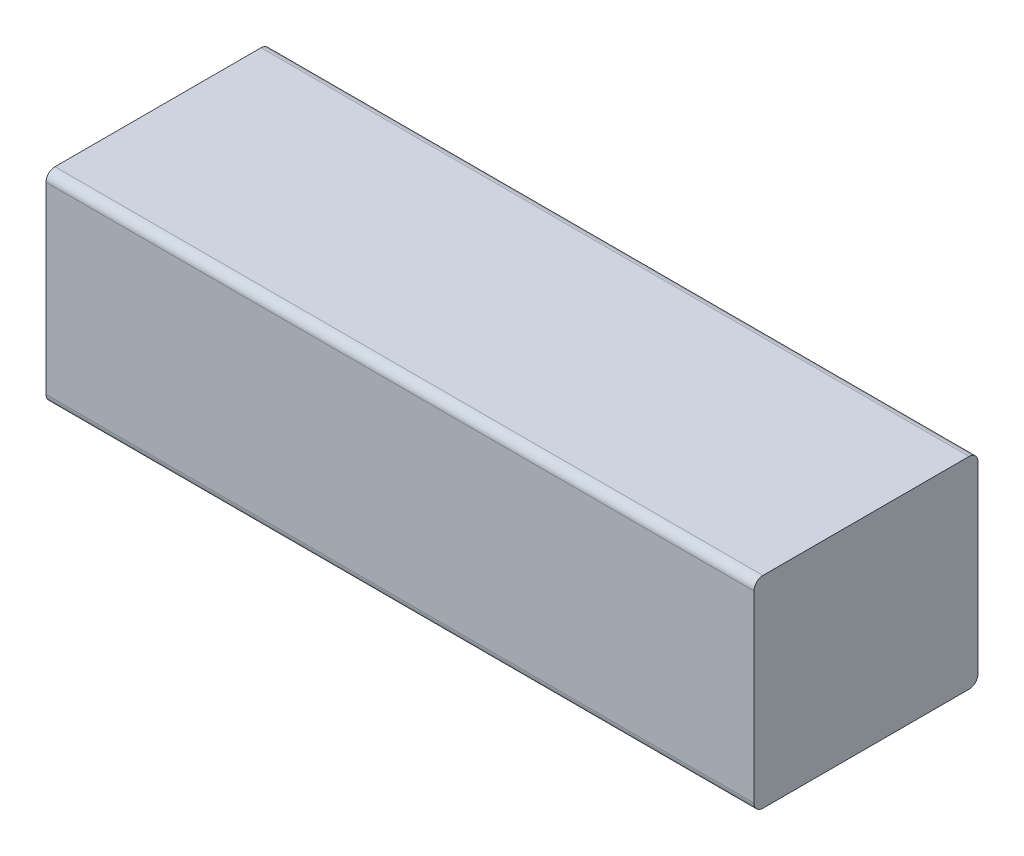
ISO-10303-21;
HEADER;
FILE_DESCRIPTION(('STEP AP214'),'2;1');
FILE_NAME('part.step','',(''),(''),'','','');
FILE_SCHEMA(('AUTOMOTIVE_DESIGN { 1 0 10303 214 1 1 1 1 }'));
ENDSEC;
DATA;
#1=APPLICATION_CONTEXT('core data for automotive mechanical design processes');
#2=APPLICATION_PROTOCOL_DEFINITION('international standard','automotive_design',2000,#1);
#3=PRODUCT_CONTEXT('',#1,'mechanical');
#4=PRODUCT('Part','Part','',(#3));
#5=PRODUCT_RELATED_PRODUCT_CATEGORY('part','',(#4));
#6=PRODUCT_DEFINITION_FORMATION('','',#4);
#7=PRODUCT_DEFINITION_CONTEXT('part definition',#1,'design');
#8=PRODUCT_DEFINITION('design','',#6,#7);
#9=PRODUCT_DEFINITION_SHAPE('','',#8);
#10=(LENGTH_UNIT() NAMED_UNIT(*) SI_UNIT(.MILLI.,.METRE.));
#11=(NAMED_UNIT(*) PLANE_ANGLE_UNIT() SI_UNIT($,.RADIAN.));
#12=(NAMED_UNIT(*) SI_UNIT($,.STERADIAN.) SOLID_ANGLE_UNIT());
#13=UNCERTAINTY_MEASURE_WITH_UNIT(LENGTH_MEASURE(1.E-05),#10,'distance_accuracy_value','');
#14=(GEOMETRIC_REPRESENTATION_CONTEXT(3) GLOBAL_UNCERTAINTY_ASSIGNED_CONTEXT((#13)) GLOBAL_UNIT_ASSIGNED_CONTEXT((#10,
#11,#12)) REPRESENTATION_CONTEXT('',''));
#15=CARTESIAN_POINT('',(0.,0.,0.));
#16=DIRECTION('',(0.,0.,1.));
#17=DIRECTION('',(1.,0.,0.));
#18=AXIS2_PLACEMENT_3D('',#15,#16,#17);
#19=CARTESIAN_POINT('',(0.,0.,50.));
#20=DIRECTION('',(1.,0.,0.));
#21=DIRECTION('',(0.,1.,0.));
#22=AXIS2_PLACEMENT_3D('',#19,#20,#21);
#23=PLANE('',#22);
#24=DIRECTION('',(0.,-1.,0.));
#25=VECTOR('',#24,1.);
#26=CARTESIAN_POINT('',(0.,0.,0.));
#27=LINE('',#26,#25);
#28=CARTESIAN_POINT('',(0.,-2.,0.));
#29=VERTEX_POINT('',#28);
#30=CARTESIAN_POINT('',(0.,-43.,0.));
#31=VERTEX_POINT('',#30);
#32=EDGE_CURVE('E201',#29,#31,#27,.T.);
#33=ORIENTED_EDGE('',*,*,#32,.T.);
#34=CARTESIAN_POINT('',(0.,-43.,2.));
#35=DIRECTION('',(1.,0.,0.));
#36=DIRECTION('',(0.,1.,0.));
#37=AXIS2_PLACEMENT_3D('',#34,#35,#36);
#38=CIRCLE('',#37,2.);
#39=CARTESIAN_POINT('',(0.,-45.,2.));
#40=VERTEX_POINT('',#39);
#41=EDGE_CURVE('E167',#31,#40,#38,.F.);
#42=ORIENTED_EDGE('',*,*,#41,.T.);
#43=DIRECTION('',(0.,0.,-1.));
#44=VECTOR('',#43,1.);
#45=CARTESIAN_POINT('',(0.,-45.,50.));
#46=LINE('',#45,#44);
#47=CARTESIAN_POINT('',(0.,-45.,48.));
#48=VERTEX_POINT('',#47);
#49=EDGE_CURVE('E135',#48,#40,#46,.T.);
#50=ORIENTED_EDGE('',*,*,#49,.F.);
#51=CARTESIAN_POINT('',(0.,-43.,48.));
#52=DIRECTION('',(1.,0.,0.));
#53=DIRECTION('',(0.,1.,0.));
#54=AXIS2_PLACEMENT_3D('',#51,#52,#53);
#55=CIRCLE('',#54,2.);
#56=CARTESIAN_POINT('',(0.,-43.,50.));
#57=VERTEX_POINT('',#56);
#58=EDGE_CURVE('E140',#48,#57,#55,.F.);
#59=ORIENTED_EDGE('',*,*,#58,.T.);
#60=DIRECTION('',(0.,-1.,0.));
#61=VECTOR('',#60,1.);
#62=CARTESIAN_POINT('',(0.,0.,50.));
#63=LINE('',#62,#61);
#64=CARTESIAN_POINT('',(0.,-2.,50.));
#65=VERTEX_POINT('',#64);
#66=EDGE_CURVE('E193',#65,#57,#63,.T.);
#67=ORIENTED_EDGE('',*,*,#66,.F.);
#68=CARTESIAN_POINT('',(0.,-2.,48.));
#69=DIRECTION('',(1.,0.,0.));
#70=DIRECTION('',(0.,1.,0.));
#71=AXIS2_PLACEMENT_3D('',#68,#69,#70);
#72=CIRCLE('',#71,2.);
#73=CARTESIAN_POINT('',(0.,0.,48.));
#74=VERTEX_POINT('',#73);
#75=EDGE_CURVE('E68',#65,#74,#72,.F.);
#76=ORIENTED_EDGE('',*,*,#75,.T.);
#77=DIRECTION('',(0.,0.,-1.));
#78=VECTOR('',#77,1.);
#79=CARTESIAN_POINT('',(0.,0.,50.));
#80=LINE('',#79,#78);
#81=CARTESIAN_POINT('',(0.,0.,2.));
#82=VERTEX_POINT('',#81);
#83=EDGE_CURVE('E182',#74,#82,#80,.T.);
#84=ORIENTED_EDGE('',*,*,#83,.T.);
#85=CARTESIAN_POINT('',(0.,-2.,2.));
#86=DIRECTION('',(1.,0.,0.));
#87=DIRECTION('',(0.,1.,0.));
#88=AXIS2_PLACEMENT_3D('',#85,#86,#87);
#89=CIRCLE('',#88,2.);
#90=EDGE_CURVE('E61',#82,#29,#89,.F.);
#91=ORIENTED_EDGE('',*,*,#90,.T.);
#92=EDGE_LOOP('',(#33,#42,#50,#59,#67,#76,#84,#91));
#93=FACE_BOUND('',#92,.T.);
#94=ADVANCED_FACE('F45',(#93),#23,.F.);
#95=CARTESIAN_POINT('',(0.,-45.,50.));
#96=DIRECTION('',(0.,1.,0.));
#97=DIRECTION('',(0.,0.,1.));
#98=AXIS2_PLACEMENT_3D('',#95,#96,#97);
#99=PLANE('',#98);
#100=ORIENTED_EDGE('',*,*,#49,.T.);
#101=DIRECTION('',(1.,0.,0.));
#102=VECTOR('',#101,1.);
#103=CARTESIAN_POINT('',(0.,-45.,2.));
#104=LINE('',#103,#102);
#105=CARTESIAN_POINT('',(158.,-45.,2.));
#106=VERTEX_POINT('',#105);
#107=EDGE_CURVE('E133',#40,#106,#104,.T.);
#108=ORIENTED_EDGE('',*,*,#107,.T.);
#109=DIRECTION('',(0.,0.,-1.));
#110=VECTOR('',#109,1.);
#111=CARTESIAN_POINT('',(158.,-45.,50.));
#112=LINE('',#111,#110);
#113=CARTESIAN_POINT('',(158.,-45.,48.));
#114=VERTEX_POINT('',#113);
#115=EDGE_CURVE('E115',#114,#106,#112,.T.);
#116=ORIENTED_EDGE('',*,*,#115,.F.);
#117=DIRECTION('',(1.,0.,0.));
#118=VECTOR('',#117,1.);
#119=CARTESIAN_POINT('',(0.,-45.,48.));
#120=LINE('',#119,#118);
#121=EDGE_CURVE('E130',#114,#48,#120,.F.);
#122=ORIENTED_EDGE('',*,*,#121,.T.);
#123=EDGE_LOOP('',(#100,#108,#116,#122));
#124=FACE_BOUND('',#123,.T.);
#125=ADVANCED_FACE('F129',(#124),#99,.F.);
#126=CARTESIAN_POINT('',(158.,0.,50.));
#127=DIRECTION('',(-1.,0.,0.));
#128=DIRECTION('',(0.,0.,1.));
#129=AXIS2_PLACEMENT_3D('',#126,#127,#128);
#130=PLANE('',#129);
#131=ORIENTED_EDGE('',*,*,#115,.T.);
#132=CARTESIAN_POINT('',(158.,-43.,2.));
#133=DIRECTION('',(-1.,0.,0.));
#134=DIRECTION('',(0.,0.,1.));
#135=AXIS2_PLACEMENT_3D('',#132,#133,#134);
#136=CIRCLE('',#135,2.);
#137=CARTESIAN_POINT('',(158.,-43.,0.));
#138=VERTEX_POINT('',#137);
#139=EDGE_CURVE('E123',#106,#138,#136,.F.);
#140=ORIENTED_EDGE('',*,*,#139,.T.);
#141=DIRECTION('',(0.,1.,0.));
#142=VECTOR('',#141,1.);
#143=CARTESIAN_POINT('',(158.,0.,0.));
#144=LINE('',#143,#142);
#145=CARTESIAN_POINT('',(158.,-2.,0.));
#146=VERTEX_POINT('',#145);
#147=EDGE_CURVE('E196',#138,#146,#144,.T.);
#148=ORIENTED_EDGE('',*,*,#147,.T.);
#149=CARTESIAN_POINT('',(158.,-2.,2.));
#150=DIRECTION('',(-1.,0.,0.));
#151=DIRECTION('',(0.,0.,1.));
#152=AXIS2_PLACEMENT_3D('',#149,#150,#151);
#153=CIRCLE('',#152,2.);
#154=CARTESIAN_POINT('',(158.,0.,2.));
#155=VERTEX_POINT('',#154);
#156=EDGE_CURVE('E124',#146,#155,#153,.F.);
#157=ORIENTED_EDGE('',*,*,#156,.T.);
#158=DIRECTION('',(0.,0.,-1.));
#159=VECTOR('',#158,1.);
#160=CARTESIAN_POINT('',(158.,0.,50.));
#161=LINE('',#160,#159);
#162=CARTESIAN_POINT('',(158.,0.,48.));
#163=VERTEX_POINT('',#162);
#164=EDGE_CURVE('E136',#163,#155,#161,.T.);
#165=ORIENTED_EDGE('',*,*,#164,.F.);
#166=CARTESIAN_POINT('',(158.,-2.,48.));
#167=DIRECTION('',(-1.,0.,0.));
#168=DIRECTION('',(0.,0.,1.));
#169=AXIS2_PLACEMENT_3D('',#166,#167,#168);
#170=CIRCLE('',#169,2.);
#171=CARTESIAN_POINT('',(158.,-2.,50.));
#172=VERTEX_POINT('',#171);
#173=EDGE_CURVE('E145',#163,#172,#170,.F.);
#174=ORIENTED_EDGE('',*,*,#173,.T.);
#175=DIRECTION('',(0.,1.,0.));
#176=VECTOR('',#175,1.);
#177=CARTESIAN_POINT('',(158.,0.,50.));
#178=LINE('',#177,#176);
#179=CARTESIAN_POINT('',(158.,-43.,50.));
#180=VERTEX_POINT('',#179);
#181=EDGE_CURVE('E117',#180,#172,#178,.T.);
#182=ORIENTED_EDGE('',*,*,#181,.F.);
#183=CARTESIAN_POINT('',(158.,-43.,48.));
#184=DIRECTION('',(-1.,0.,0.));
#185=DIRECTION('',(0.,0.,1.));
#186=AXIS2_PLACEMENT_3D('',#183,#184,#185);
#187=CIRCLE('',#186,2.);
#188=EDGE_CURVE('E112',#180,#114,#187,.F.);
#189=ORIENTED_EDGE('',*,*,#188,.T.);
#190=EDGE_LOOP('',(#131,#140,#148,#157,#165,#174,#182,#189));
#191=FACE_BOUND('',#190,.T.);
#192=ADVANCED_FACE('F114',(#191),#130,.F.);
#193=CARTESIAN_POINT('',(0.,0.,50.));
#194=DIRECTION('',(0.,-1.,0.));
#195=DIRECTION('',(0.,0.,-1.));
#196=AXIS2_PLACEMENT_3D('',#193,#194,#195);
#197=PLANE('',#196);
#198=ORIENTED_EDGE('',*,*,#164,.T.);
#199=DIRECTION('',(-1.,0.,0.));
#200=VECTOR('',#199,1.);
#201=CARTESIAN_POINT('',(0.,0.,2.));
#202=LINE('',#201,#200);
#203=EDGE_CURVE('E11',#155,#82,#202,.T.);
#204=ORIENTED_EDGE('',*,*,#203,.T.);
#205=ORIENTED_EDGE('',*,*,#83,.F.);
#206=DIRECTION('',(-1.,0.,0.));
#207=VECTOR('',#206,1.);
#208=CARTESIAN_POINT('',(158.,0.,48.));
#209=LINE('',#208,#207);
#210=EDGE_CURVE('E54',#74,#163,#209,.F.);
#211=ORIENTED_EDGE('',*,*,#210,.T.);
#212=EDGE_LOOP('',(#198,#204,#205,#211));
#213=FACE_BOUND('',#212,.T.);
#214=ADVANCED_FACE('F181',(#213),#197,.F.);
#215=CARTESIAN_POINT('',(0.,0.,50.));
#216=DIRECTION('',(0.,0.,1.));
#217=DIRECTION('',(1.,0.,0.));
#218=AXIS2_PLACEMENT_3D('',#215,#216,#217);
#219=PLANE('',#218);
#220=ORIENTED_EDGE('',*,*,#66,.T.);
#221=DIRECTION('',(1.,0.,0.));
#222=VECTOR('',#221,1.);
#223=CARTESIAN_POINT('',(158.,-43.,50.));
#224=LINE('',#223,#222);
#225=EDGE_CURVE('E174',#57,#180,#224,.T.);
#226=ORIENTED_EDGE('',*,*,#225,.T.);
#227=ORIENTED_EDGE('',*,*,#181,.T.);
#228=DIRECTION('',(-1.,0.,0.));
#229=VECTOR('',#228,1.);
#230=CARTESIAN_POINT('',(0.,-2.,50.));
#231=LINE('',#230,#229);
#232=EDGE_CURVE('E170',#172,#65,#231,.T.);
#233=ORIENTED_EDGE('',*,*,#232,.T.);
#234=EDGE_LOOP('',(#220,#226,#227,#233));
#235=FACE_BOUND('',#234,.T.);
#236=ADVANCED_FACE('F192',(#235),#219,.T.);
#237=CARTESIAN_POINT('',(0.,0.,0.));
#238=DIRECTION('',(0.,0.,1.));
#239=DIRECTION('',(1.,0.,0.));
#240=AXIS2_PLACEMENT_3D('',#237,#238,#239);
#241=PLANE('',#240);
#242=ORIENTED_EDGE('',*,*,#147,.F.);
#243=DIRECTION('',(1.,0.,0.));
#244=VECTOR('',#243,1.);
#245=CARTESIAN_POINT('',(0.,-43.,0.));
#246=LINE('',#245,#244);
#247=EDGE_CURVE('E158',#138,#31,#246,.F.);
#248=ORIENTED_EDGE('',*,*,#247,.T.);
#249=ORIENTED_EDGE('',*,*,#32,.F.);
#250=DIRECTION('',(-1.,0.,0.));
#251=VECTOR('',#250,1.);
#252=CARTESIAN_POINT('',(0.,-2.,0.));
#253=LINE('',#252,#251);
#254=EDGE_CURVE('E155',#29,#146,#253,.F.);
#255=ORIENTED_EDGE('',*,*,#254,.T.);
#256=EDGE_LOOP('',(#242,#248,#249,#255));
#257=FACE_BOUND('',#256,.T.);
#258=ADVANCED_FACE('F211',(#257),#241,.F.);
#259=CARTESIAN_POINT('',(0.,-43.,2.));
#260=DIRECTION('',(1.,0.,0.));
#261=DIRECTION('',(0.,0.,-1.));
#262=AXIS2_PLACEMENT_3D('',#259,#260,#261);
#263=CYLINDRICAL_SURFACE('',#262,2.);
#264=ORIENTED_EDGE('',*,*,#41,.F.);
#265=ORIENTED_EDGE('',*,*,#247,.F.);
#266=ORIENTED_EDGE('',*,*,#139,.F.);
#267=ORIENTED_EDGE('',*,*,#107,.F.);
#268=EDGE_LOOP('',(#264,#265,#266,#267));
#269=FACE_BOUND('',#268,.T.);
#270=ADVANCED_FACE('F219',(#269),#263,.T.);
#271=CARTESIAN_POINT('',(0.,-43.,48.));
#272=DIRECTION('',(-1.,0.,0.));
#273=DIRECTION('',(0.,0.,1.));
#274=AXIS2_PLACEMENT_3D('',#271,#272,#273);
#275=CYLINDRICAL_SURFACE('',#274,2.);
#276=ORIENTED_EDGE('',*,*,#58,.F.);
#277=ORIENTED_EDGE('',*,*,#121,.F.);
#278=ORIENTED_EDGE('',*,*,#188,.F.);
#279=ORIENTED_EDGE('',*,*,#225,.F.);
#280=EDGE_LOOP('',(#276,#277,#278,#279));
#281=FACE_BOUND('',#280,.T.);
#282=ADVANCED_FACE('F139',(#281),#275,.T.);
#283=CARTESIAN_POINT('',(0.,-2.,2.));
#284=DIRECTION('',(-1.,0.,0.));
#285=DIRECTION('',(0.,0.,1.));
#286=AXIS2_PLACEMENT_3D('',#283,#284,#285);
#287=CYLINDRICAL_SURFACE('',#286,2.);
#288=ORIENTED_EDGE('',*,*,#156,.F.);
#289=ORIENTED_EDGE('',*,*,#254,.F.);
#290=ORIENTED_EDGE('',*,*,#90,.F.);
#291=ORIENTED_EDGE('',*,*,#203,.F.);
#292=EDGE_LOOP('',(#288,#289,#290,#291));
#293=FACE_BOUND('',#292,.T.);
#294=ADVANCED_FACE('F213',(#293),#287,.T.);
#295=CARTESIAN_POINT('',(0.,-2.,48.));
#296=DIRECTION('',(1.,0.,0.));
#297=DIRECTION('',(0.,0.,-1.));
#298=AXIS2_PLACEMENT_3D('',#295,#296,#297);
#299=CYLINDRICAL_SURFACE('',#298,2.);
#300=ORIENTED_EDGE('',*,*,#173,.F.);
#301=ORIENTED_EDGE('',*,*,#210,.F.);
#302=ORIENTED_EDGE('',*,*,#75,.F.);
#303=ORIENTED_EDGE('',*,*,#232,.F.);
#304=EDGE_LOOP('',(#300,#301,#302,#303));
#305=FACE_BOUND('',#304,.T.);
#306=ADVANCED_FACE('F47',(#305),#299,.T.);
#307=CLOSED_SHELL('',(#94,#125,#192,#214,#236,#258,#270,#282,#294,#306));
#308=MANIFOLD_SOLID_BREP('B2',#307);
#309=ADVANCED_BREP_SHAPE_REPRESENTATION('',(#18,#308),#14);
#310=SHAPE_DEFINITION_REPRESENTATION(#9,#309);
ENDSEC;
END-ISO-10303-21;
